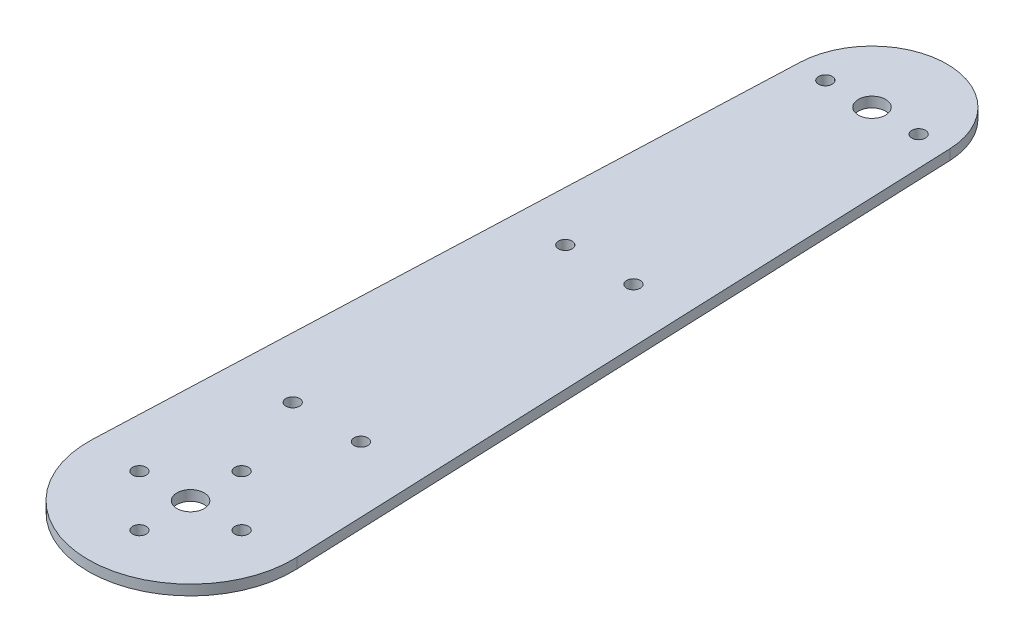
ISO-10303-21;
HEADER;
FILE_DESCRIPTION(('STEP AP214'),'2;1');
FILE_NAME('part.step','',(''),(''),'','','');
FILE_SCHEMA(('AUTOMOTIVE_DESIGN { 1 0 10303 214 1 1 1 1 }'));
ENDSEC;
DATA;
#1=APPLICATION_CONTEXT('core data for automotive mechanical design processes');
#2=APPLICATION_PROTOCOL_DEFINITION('international standard','automotive_design',2000,#1);
#3=PRODUCT_CONTEXT('',#1,'mechanical');
#4=PRODUCT('Part','Part','',(#3));
#5=PRODUCT_RELATED_PRODUCT_CATEGORY('part','',(#4));
#6=PRODUCT_DEFINITION_FORMATION('','',#4);
#7=PRODUCT_DEFINITION_CONTEXT('part definition',#1,'design');
#8=PRODUCT_DEFINITION('design','',#6,#7);
#9=PRODUCT_DEFINITION_SHAPE('','',#8);
#10=(LENGTH_UNIT() NAMED_UNIT(*) SI_UNIT(.MILLI.,.METRE.));
#11=(NAMED_UNIT(*) PLANE_ANGLE_UNIT() SI_UNIT($,.RADIAN.));
#12=(NAMED_UNIT(*) SI_UNIT($,.STERADIAN.) SOLID_ANGLE_UNIT());
#13=UNCERTAINTY_MEASURE_WITH_UNIT(LENGTH_MEASURE(1.E-05),#10,'distance_accuracy_value','');
#14=(GEOMETRIC_REPRESENTATION_CONTEXT(3) GLOBAL_UNCERTAINTY_ASSIGNED_CONTEXT((#13)) GLOBAL_UNIT_ASSIGNED_CONTEXT((#10,
#11,#12)) REPRESENTATION_CONTEXT('',''));
#15=CARTESIAN_POINT('',(0.,0.,0.));
#16=DIRECTION('',(0.,0.,1.));
#17=DIRECTION('',(1.,0.,0.));
#18=AXIS2_PLACEMENT_3D('',#15,#16,#17);
#19=CARTESIAN_POINT('',(0.,-3.,-200.));
#20=DIRECTION('',(0.,1.,0.));
#21=DIRECTION('',(0.,0.,1.));
#22=AXIS2_PLACEMENT_3D('',#19,#20,#21);
#23=CYLINDRICAL_SURFACE('',#22,22.);
#24=CARTESIAN_POINT('',(0.,0.,-200.));
#25=DIRECTION('',(0.,1.,0.));
#26=DIRECTION('',(0.,0.,1.));
#27=AXIS2_PLACEMENT_3D('',#24,#25,#26);
#28=CIRCLE('',#27,22.);
#29=CARTESIAN_POINT('',(21.9823929543624,0.,-200.88));
#30=VERTEX_POINT('',#29);
#31=CARTESIAN_POINT('',(-21.9823929543624,0.,-200.88));
#32=VERTEX_POINT('',#31);
#33=EDGE_CURVE('E102',#30,#32,#28,.T.);
#34=ORIENTED_EDGE('',*,*,#33,.F.);
#35=DIRECTION('',(0.,1.,0.));
#36=VECTOR('',#35,1.);
#37=CARTESIAN_POINT('',(21.9823929543624,-3.,-200.88));
#38=LINE('',#37,#36);
#39=CARTESIAN_POINT('',(21.9823929543624,-3.,-200.88));
#40=VERTEX_POINT('',#39);
#41=EDGE_CURVE('E11',#40,#30,#38,.T.);
#42=ORIENTED_EDGE('',*,*,#41,.F.);
#43=CARTESIAN_POINT('',(0.,-3.,-200.));
#44=DIRECTION('',(0.,1.,0.));
#45=DIRECTION('',(0.,0.,1.));
#46=AXIS2_PLACEMENT_3D('',#43,#44,#45);
#47=CIRCLE('',#46,22.);
#48=CARTESIAN_POINT('',(-21.9823929543624,-3.,-200.88));
#49=VERTEX_POINT('',#48);
#50=EDGE_CURVE('E95',#40,#49,#47,.T.);
#51=ORIENTED_EDGE('',*,*,#50,.T.);
#52=DIRECTION('',(0.,1.,0.));
#53=VECTOR('',#52,1.);
#54=CARTESIAN_POINT('',(-21.9823929543624,-3.,-200.88));
#55=LINE('',#54,#53);
#56=EDGE_CURVE('E40',#49,#32,#55,.T.);
#57=ORIENTED_EDGE('',*,*,#56,.T.);
#58=EDGE_LOOP('',(#34,#42,#51,#57));
#59=FACE_BOUND('',#58,.T.);
#60=ADVANCED_FACE('F37',(#59),#23,.T.);
#61=CARTESIAN_POINT('',(21.9823929543624,-3.,-200.88));
#62=DIRECTION('',(0.999199679743744,0.,-0.04));
#63=DIRECTION('',(-0.04,0.,-0.999199679743744));
#64=AXIS2_PLACEMENT_3D('',#61,#62,#63);
#65=PLANE('',#64);
#66=DIRECTION('',(-0.04,0.,-0.999199679743744));
#67=VECTOR('',#66,1.);
#68=CARTESIAN_POINT('',(21.9823929543624,0.,-200.88));
#69=LINE('',#68,#67);
#70=CARTESIAN_POINT('',(29.9759903923123,0.,-1.2));
#71=VERTEX_POINT('',#70);
#72=EDGE_CURVE('E97',#71,#30,#69,.T.);
#73=ORIENTED_EDGE('',*,*,#72,.F.);
#74=DIRECTION('',(0.,1.,0.));
#75=VECTOR('',#74,1.);
#76=CARTESIAN_POINT('',(29.9759903923123,-3.,-1.2));
#77=LINE('',#76,#75);
#78=CARTESIAN_POINT('',(29.9759903923123,-3.,-1.2));
#79=VERTEX_POINT('',#78);
#80=EDGE_CURVE('E46',#79,#71,#77,.T.);
#81=ORIENTED_EDGE('',*,*,#80,.F.);
#82=DIRECTION('',(-0.04,0.,-0.999199679743744));
#83=VECTOR('',#82,1.);
#84=CARTESIAN_POINT('',(21.9823929543624,-3.,-200.88));
#85=LINE('',#84,#83);
#86=EDGE_CURVE('E92',#79,#40,#85,.T.);
#87=ORIENTED_EDGE('',*,*,#86,.T.);
#88=ORIENTED_EDGE('',*,*,#41,.T.);
#89=EDGE_LOOP('',(#73,#81,#87,#88));
#90=FACE_BOUND('',#89,.T.);
#91=ADVANCED_FACE('F113',(#90),#65,.T.);
#92=CARTESIAN_POINT('',(0.,-3.,0.));
#93=DIRECTION('',(0.,1.,0.));
#94=DIRECTION('',(0.,0.,1.));
#95=AXIS2_PLACEMENT_3D('',#92,#93,#94);
#96=CYLINDRICAL_SURFACE('',#95,30.);
#97=CARTESIAN_POINT('',(0.,0.,0.));
#98=DIRECTION('',(0.,1.,0.));
#99=DIRECTION('',(0.,0.,1.));
#100=AXIS2_PLACEMENT_3D('',#97,#98,#99);
#101=CIRCLE('',#100,30.);
#102=CARTESIAN_POINT('',(-29.9759903923123,0.,-1.20000000000001));
#103=VERTEX_POINT('',#102);
#104=EDGE_CURVE('E87',#103,#71,#101,.T.);
#105=ORIENTED_EDGE('',*,*,#104,.F.);
#106=DIRECTION('',(0.,1.,0.));
#107=VECTOR('',#106,1.);
#108=CARTESIAN_POINT('',(-29.9759903923123,-3.,-1.20000000000001));
#109=LINE('',#108,#107);
#110=CARTESIAN_POINT('',(-29.9759903923123,-3.,-1.20000000000001));
#111=VERTEX_POINT('',#110);
#112=EDGE_CURVE('E82',#111,#103,#109,.T.);
#113=ORIENTED_EDGE('',*,*,#112,.F.);
#114=CARTESIAN_POINT('',(0.,-3.,0.));
#115=DIRECTION('',(0.,1.,0.));
#116=DIRECTION('',(0.,0.,1.));
#117=AXIS2_PLACEMENT_3D('',#114,#115,#116);
#118=CIRCLE('',#117,30.);
#119=EDGE_CURVE('E85',#111,#79,#118,.T.);
#120=ORIENTED_EDGE('',*,*,#119,.T.);
#121=ORIENTED_EDGE('',*,*,#80,.T.);
#122=EDGE_LOOP('',(#105,#113,#120,#121));
#123=FACE_BOUND('',#122,.T.);
#124=ADVANCED_FACE('F84',(#123),#96,.T.);
#125=CARTESIAN_POINT('',(-21.9823929543624,-3.,-200.88));
#126=DIRECTION('',(-0.999199679743744,0.,-0.04));
#127=DIRECTION('',(-0.04,0.,0.999199679743744));
#128=AXIS2_PLACEMENT_3D('',#125,#126,#127);
#129=PLANE('',#128);
#130=DIRECTION('',(-0.04,0.,0.999199679743744));
#131=VECTOR('',#130,1.);
#132=CARTESIAN_POINT('',(-21.9823929543624,0.,-200.88));
#133=LINE('',#132,#131);
#134=EDGE_CURVE('E105',#32,#103,#133,.T.);
#135=ORIENTED_EDGE('',*,*,#134,.F.);
#136=ORIENTED_EDGE('',*,*,#56,.F.);
#137=DIRECTION('',(-0.04,0.,0.999199679743744));
#138=VECTOR('',#137,1.);
#139=CARTESIAN_POINT('',(-21.9823929543624,-3.,-200.88));
#140=LINE('',#139,#138);
#141=EDGE_CURVE('E91',#49,#111,#140,.T.);
#142=ORIENTED_EDGE('',*,*,#141,.T.);
#143=ORIENTED_EDGE('',*,*,#112,.T.);
#144=EDGE_LOOP('',(#135,#136,#142,#143));
#145=FACE_BOUND('',#144,.T.);
#146=ADVANCED_FACE('F94',(#145),#129,.T.);
#147=CARTESIAN_POINT('',(0.,-3.,-200.));
#148=DIRECTION('',(0.,1.,0.));
#149=DIRECTION('',(0.,0.,1.));
#150=AXIS2_PLACEMENT_3D('',#147,#148,#149);
#151=PLANE('',#150);
#152=CARTESIAN_POINT('',(13.6930321584146,-3.,-200.));
#153=DIRECTION('',(0.,1.,0.));
#154=DIRECTION('',(0.,0.,-1.));
#155=AXIS2_PLACEMENT_3D('',#152,#153,#154);
#156=CIRCLE('',#155,2.);
#157=CARTESIAN_POINT('',(13.6930321584146,-3.,-202.));
#158=VERTEX_POINT('',#157);
#159=EDGE_CURVE('E186',#158,#158,#156,.T.);
#160=ORIENTED_EDGE('',*,*,#159,.T.);
#161=EDGE_LOOP('',(#160));
#162=FACE_BOUND('',#161,.T.);
#163=CARTESIAN_POINT('',(-13.6930321584146,-3.,-200.));
#164=DIRECTION('',(0.,1.,0.));
#165=DIRECTION('',(0.,0.,1.));
#166=AXIS2_PLACEMENT_3D('',#163,#164,#165);
#167=CIRCLE('',#166,2.);
#168=CARTESIAN_POINT('',(-13.6930321584146,-3.,-198.));
#169=VERTEX_POINT('',#168);
#170=EDGE_CURVE('E194',#169,#169,#167,.T.);
#171=ORIENTED_EDGE('',*,*,#170,.T.);
#172=EDGE_LOOP('',(#171));
#173=FACE_BOUND('',#172,.T.);
#174=CARTESIAN_POINT('',(-15.,-3.,-1.57116660247941E-13));
#175=DIRECTION('',(0.,1.,0.));
#176=DIRECTION('',(0.,0.,1.));
#177=AXIS2_PLACEMENT_3D('',#174,#175,#176);
#178=CIRCLE('',#177,2.);
#179=CARTESIAN_POINT('',(-15.,-3.,1.99999999999984));
#180=VERTEX_POINT('',#179);
#181=EDGE_CURVE('E200',#180,#180,#178,.T.);
#182=ORIENTED_EDGE('',*,*,#181,.T.);
#183=EDGE_LOOP('',(#182));
#184=FACE_BOUND('',#183,.T.);
#185=CARTESIAN_POINT('',(-1.04744440165294E-13,-3.,15.));
#186=DIRECTION('',(0.,1.,0.));
#187=DIRECTION('',(0.,0.,1.));
#188=AXIS2_PLACEMENT_3D('',#185,#186,#187);
#189=CIRCLE('',#188,2.);
#190=CARTESIAN_POINT('',(-1.04744440165294E-13,-3.,17.));
#191=VERTEX_POINT('',#190);
#192=EDGE_CURVE('E206',#191,#191,#189,.T.);
#193=ORIENTED_EDGE('',*,*,#192,.T.);
#194=EDGE_LOOP('',(#193));
#195=FACE_BOUND('',#194,.T.);
#196=CARTESIAN_POINT('',(15.,-3.,0.));
#197=DIRECTION('',(0.,1.,0.));
#198=DIRECTION('',(0.,0.,1.));
#199=AXIS2_PLACEMENT_3D('',#196,#197,#198);
#200=CIRCLE('',#199,2.);
#201=CARTESIAN_POINT('',(15.,-3.,2.00000000000005));
#202=VERTEX_POINT('',#201);
#203=EDGE_CURVE('E212',#202,#202,#200,.T.);
#204=ORIENTED_EDGE('',*,*,#203,.T.);
#205=EDGE_LOOP('',(#204));
#206=FACE_BOUND('',#205,.T.);
#207=CARTESIAN_POINT('',(0.,-3.,-15.));
#208=DIRECTION('',(0.,1.,0.));
#209=DIRECTION('',(0.,0.,1.));
#210=AXIS2_PLACEMENT_3D('',#207,#208,#209);
#211=CIRCLE('',#210,2.);
#212=CARTESIAN_POINT('',(0.,-3.,-13.));
#213=VERTEX_POINT('',#212);
#214=EDGE_CURVE('E218',#213,#213,#211,.T.);
#215=ORIENTED_EDGE('',*,*,#214,.T.);
#216=EDGE_LOOP('',(#215));
#217=FACE_BOUND('',#216,.T.);
#218=CARTESIAN_POINT('',(-10.,-3.,-40.));
#219=DIRECTION('',(0.,1.,0.));
#220=DIRECTION('',(0.,0.,1.));
#221=AXIS2_PLACEMENT_3D('',#218,#219,#220);
#222=CIRCLE('',#221,2.);
#223=CARTESIAN_POINT('',(-10.,-3.,-38.));
#224=VERTEX_POINT('',#223);
#225=EDGE_CURVE('E224',#224,#224,#222,.T.);
#226=ORIENTED_EDGE('',*,*,#225,.T.);
#227=EDGE_LOOP('',(#226));
#228=FACE_BOUND('',#227,.T.);
#229=CARTESIAN_POINT('',(10.,-3.,-40.));
#230=DIRECTION('',(0.,1.,0.));
#231=DIRECTION('',(0.,0.,1.));
#232=AXIS2_PLACEMENT_3D('',#229,#230,#231);
#233=CIRCLE('',#232,2.);
#234=CARTESIAN_POINT('',(10.,-3.,-38.));
#235=VERTEX_POINT('',#234);
#236=EDGE_CURVE('E230',#235,#235,#233,.T.);
#237=ORIENTED_EDGE('',*,*,#236,.T.);
#238=EDGE_LOOP('',(#237));
#239=FACE_BOUND('',#238,.T.);
#240=CARTESIAN_POINT('',(-10.,-3.,-120.));
#241=DIRECTION('',(0.,1.,0.));
#242=DIRECTION('',(0.,0.,1.));
#243=AXIS2_PLACEMENT_3D('',#240,#241,#242);
#244=CIRCLE('',#243,2.);
#245=CARTESIAN_POINT('',(-10.,-3.,-118.));
#246=VERTEX_POINT('',#245);
#247=EDGE_CURVE('E236',#246,#246,#244,.T.);
#248=ORIENTED_EDGE('',*,*,#247,.T.);
#249=EDGE_LOOP('',(#248));
#250=FACE_BOUND('',#249,.T.);
#251=CARTESIAN_POINT('',(10.,-3.,-120.));
#252=DIRECTION('',(0.,1.,0.));
#253=DIRECTION('',(0.,0.,1.));
#254=AXIS2_PLACEMENT_3D('',#251,#252,#253);
#255=CIRCLE('',#254,2.);
#256=CARTESIAN_POINT('',(10.,-3.,-118.));
#257=VERTEX_POINT('',#256);
#258=EDGE_CURVE('E242',#257,#257,#255,.T.);
#259=ORIENTED_EDGE('',*,*,#258,.T.);
#260=EDGE_LOOP('',(#259));
#261=FACE_BOUND('',#260,.T.);
#262=CARTESIAN_POINT('',(0.,-3.,-200.));
#263=DIRECTION('',(0.,1.,0.));
#264=DIRECTION('',(0.,0.,1.));
#265=AXIS2_PLACEMENT_3D('',#262,#263,#264);
#266=CIRCLE('',#265,4.);
#267=CARTESIAN_POINT('',(0.,-3.,-196.));
#268=VERTEX_POINT('',#267);
#269=EDGE_CURVE('E248',#268,#268,#266,.T.);
#270=ORIENTED_EDGE('',*,*,#269,.T.);
#271=EDGE_LOOP('',(#270));
#272=FACE_BOUND('',#271,.T.);
#273=CARTESIAN_POINT('',(0.,-3.,0.));
#274=DIRECTION('',(0.,1.,0.));
#275=DIRECTION('',(0.,0.,1.));
#276=AXIS2_PLACEMENT_3D('',#273,#274,#275);
#277=CIRCLE('',#276,4.);
#278=CARTESIAN_POINT('',(0.,-3.,4.));
#279=VERTEX_POINT('',#278);
#280=EDGE_CURVE('E106',#279,#279,#277,.T.);
#281=ORIENTED_EDGE('',*,*,#280,.T.);
#282=EDGE_LOOP('',(#281));
#283=FACE_BOUND('',#282,.T.);
#284=ORIENTED_EDGE('',*,*,#50,.F.);
#285=ORIENTED_EDGE('',*,*,#86,.F.);
#286=ORIENTED_EDGE('',*,*,#119,.F.);
#287=ORIENTED_EDGE('',*,*,#141,.F.);
#288=EDGE_LOOP('',(#284,#285,#286,#287));
#289=FACE_BOUND('',#288,.T.);
#290=ADVANCED_FACE('F90',(#162,#173,#184,#195,#206,#217,#228,#239,#250,#261,#272,#283,#289),
#151,.F.);
#291=CARTESIAN_POINT('',(0.,0.,-200.));
#292=DIRECTION('',(0.,1.,0.));
#293=DIRECTION('',(0.,0.,1.));
#294=AXIS2_PLACEMENT_3D('',#291,#292,#293);
#295=PLANE('',#294);
#296=CARTESIAN_POINT('',(13.6930321584146,0.,-200.));
#297=DIRECTION('',(0.,1.,0.));
#298=DIRECTION('',(0.,0.,-1.));
#299=AXIS2_PLACEMENT_3D('',#296,#297,#298);
#300=CIRCLE('',#299,2.);
#301=CARTESIAN_POINT('',(13.6930321584146,0.,-202.));
#302=VERTEX_POINT('',#301);
#303=EDGE_CURVE('E189',#302,#302,#300,.T.);
#304=ORIENTED_EDGE('',*,*,#303,.F.);
#305=EDGE_LOOP('',(#304));
#306=FACE_BOUND('',#305,.T.);
#307=CARTESIAN_POINT('',(-13.6930321584146,0.,-200.));
#308=DIRECTION('',(0.,1.,0.));
#309=DIRECTION('',(0.,0.,1.));
#310=AXIS2_PLACEMENT_3D('',#307,#308,#309);
#311=CIRCLE('',#310,2.);
#312=CARTESIAN_POINT('',(-13.6930321584146,0.,-198.));
#313=VERTEX_POINT('',#312);
#314=EDGE_CURVE('E191',#313,#313,#311,.T.);
#315=ORIENTED_EDGE('',*,*,#314,.F.);
#316=EDGE_LOOP('',(#315));
#317=FACE_BOUND('',#316,.T.);
#318=CARTESIAN_POINT('',(-15.,0.,-1.57116660247941E-13));
#319=DIRECTION('',(0.,1.,0.));
#320=DIRECTION('',(0.,0.,1.));
#321=AXIS2_PLACEMENT_3D('',#318,#319,#320);
#322=CIRCLE('',#321,2.);
#323=CARTESIAN_POINT('',(-15.,0.,1.99999999999984));
#324=VERTEX_POINT('',#323);
#325=EDGE_CURVE('E197',#324,#324,#322,.T.);
#326=ORIENTED_EDGE('',*,*,#325,.F.);
#327=EDGE_LOOP('',(#326));
#328=FACE_BOUND('',#327,.T.);
#329=CARTESIAN_POINT('',(-1.04744440165294E-13,0.,15.));
#330=DIRECTION('',(0.,1.,0.));
#331=DIRECTION('',(0.,0.,1.));
#332=AXIS2_PLACEMENT_3D('',#329,#330,#331);
#333=CIRCLE('',#332,2.);
#334=CARTESIAN_POINT('',(-1.04744440165294E-13,0.,17.));
#335=VERTEX_POINT('',#334);
#336=EDGE_CURVE('E203',#335,#335,#333,.T.);
#337=ORIENTED_EDGE('',*,*,#336,.F.);
#338=EDGE_LOOP('',(#337));
#339=FACE_BOUND('',#338,.T.);
#340=CARTESIAN_POINT('',(15.,0.,0.));
#341=DIRECTION('',(0.,1.,0.));
#342=DIRECTION('',(0.,0.,1.));
#343=AXIS2_PLACEMENT_3D('',#340,#341,#342);
#344=CIRCLE('',#343,2.);
#345=CARTESIAN_POINT('',(15.,0.,2.00000000000005));
#346=VERTEX_POINT('',#345);
#347=EDGE_CURVE('E209',#346,#346,#344,.T.);
#348=ORIENTED_EDGE('',*,*,#347,.F.);
#349=EDGE_LOOP('',(#348));
#350=FACE_BOUND('',#349,.T.);
#351=CARTESIAN_POINT('',(0.,0.,-15.));
#352=DIRECTION('',(0.,1.,0.));
#353=DIRECTION('',(0.,0.,1.));
#354=AXIS2_PLACEMENT_3D('',#351,#352,#353);
#355=CIRCLE('',#354,2.);
#356=CARTESIAN_POINT('',(0.,0.,-13.));
#357=VERTEX_POINT('',#356);
#358=EDGE_CURVE('E215',#357,#357,#355,.T.);
#359=ORIENTED_EDGE('',*,*,#358,.F.);
#360=EDGE_LOOP('',(#359));
#361=FACE_BOUND('',#360,.T.);
#362=CARTESIAN_POINT('',(-10.,0.,-40.));
#363=DIRECTION('',(0.,1.,0.));
#364=DIRECTION('',(0.,0.,1.));
#365=AXIS2_PLACEMENT_3D('',#362,#363,#364);
#366=CIRCLE('',#365,2.);
#367=CARTESIAN_POINT('',(-10.,0.,-38.));
#368=VERTEX_POINT('',#367);
#369=EDGE_CURVE('E221',#368,#368,#366,.T.);
#370=ORIENTED_EDGE('',*,*,#369,.F.);
#371=EDGE_LOOP('',(#370));
#372=FACE_BOUND('',#371,.T.);
#373=CARTESIAN_POINT('',(10.,0.,-40.));
#374=DIRECTION('',(0.,1.,0.));
#375=DIRECTION('',(0.,0.,1.));
#376=AXIS2_PLACEMENT_3D('',#373,#374,#375);
#377=CIRCLE('',#376,2.);
#378=CARTESIAN_POINT('',(10.,0.,-38.));
#379=VERTEX_POINT('',#378);
#380=EDGE_CURVE('E227',#379,#379,#377,.T.);
#381=ORIENTED_EDGE('',*,*,#380,.F.);
#382=EDGE_LOOP('',(#381));
#383=FACE_BOUND('',#382,.T.);
#384=CARTESIAN_POINT('',(-10.,0.,-120.));
#385=DIRECTION('',(0.,1.,0.));
#386=DIRECTION('',(0.,0.,1.));
#387=AXIS2_PLACEMENT_3D('',#384,#385,#386);
#388=CIRCLE('',#387,2.);
#389=CARTESIAN_POINT('',(-10.,0.,-118.));
#390=VERTEX_POINT('',#389);
#391=EDGE_CURVE('E233',#390,#390,#388,.T.);
#392=ORIENTED_EDGE('',*,*,#391,.F.);
#393=EDGE_LOOP('',(#392));
#394=FACE_BOUND('',#393,.T.);
#395=CARTESIAN_POINT('',(10.,0.,-120.));
#396=DIRECTION('',(0.,1.,0.));
#397=DIRECTION('',(0.,0.,1.));
#398=AXIS2_PLACEMENT_3D('',#395,#396,#397);
#399=CIRCLE('',#398,2.);
#400=CARTESIAN_POINT('',(10.,0.,-118.));
#401=VERTEX_POINT('',#400);
#402=EDGE_CURVE('E239',#401,#401,#399,.T.);
#403=ORIENTED_EDGE('',*,*,#402,.F.);
#404=EDGE_LOOP('',(#403));
#405=FACE_BOUND('',#404,.T.);
#406=CARTESIAN_POINT('',(0.,0.,-200.));
#407=DIRECTION('',(0.,1.,0.));
#408=DIRECTION('',(0.,0.,1.));
#409=AXIS2_PLACEMENT_3D('',#406,#407,#408);
#410=CIRCLE('',#409,4.);
#411=CARTESIAN_POINT('',(0.,0.,-196.));
#412=VERTEX_POINT('',#411);
#413=EDGE_CURVE('E245',#412,#412,#410,.T.);
#414=ORIENTED_EDGE('',*,*,#413,.F.);
#415=EDGE_LOOP('',(#414));
#416=FACE_BOUND('',#415,.T.);
#417=CARTESIAN_POINT('',(0.,0.,0.));
#418=DIRECTION('',(0.,1.,0.));
#419=DIRECTION('',(0.,0.,1.));
#420=AXIS2_PLACEMENT_3D('',#417,#418,#419);
#421=CIRCLE('',#420,4.);
#422=CARTESIAN_POINT('',(0.,0.,4.));
#423=VERTEX_POINT('',#422);
#424=EDGE_CURVE('E251',#423,#423,#421,.T.);
#425=ORIENTED_EDGE('',*,*,#424,.F.);
#426=EDGE_LOOP('',(#425));
#427=FACE_BOUND('',#426,.T.);
#428=ORIENTED_EDGE('',*,*,#33,.T.);
#429=ORIENTED_EDGE('',*,*,#134,.T.);
#430=ORIENTED_EDGE('',*,*,#104,.T.);
#431=ORIENTED_EDGE('',*,*,#72,.T.);
#432=EDGE_LOOP('',(#428,#429,#430,#431));
#433=FACE_BOUND('',#432,.T.);
#434=ADVANCED_FACE('F112',(#306,#317,#328,#339,#350,#361,#372,#383,#394,#405,#416,#427,#433),
#295,.T.);
#435=CARTESIAN_POINT('',(0.,-3.,0.));
#436=DIRECTION('',(0.,1.,0.));
#437=DIRECTION('',(0.,0.,1.));
#438=AXIS2_PLACEMENT_3D('',#435,#436,#437);
#439=CYLINDRICAL_SURFACE('',#438,4.);
#440=ORIENTED_EDGE('',*,*,#280,.F.);
#441=EDGE_LOOP('',(#440));
#442=FACE_BOUND('',#441,.T.);
#443=ORIENTED_EDGE('',*,*,#424,.T.);
#444=EDGE_LOOP('',(#443));
#445=FACE_BOUND('',#444,.T.);
#446=ADVANCED_FACE('F131',(#442,#445),#439,.F.);
#447=CARTESIAN_POINT('',(0.,-3.,-200.));
#448=DIRECTION('',(0.,1.,0.));
#449=DIRECTION('',(0.,0.,1.));
#450=AXIS2_PLACEMENT_3D('',#447,#448,#449);
#451=CYLINDRICAL_SURFACE('',#450,4.);
#452=ORIENTED_EDGE('',*,*,#269,.F.);
#453=EDGE_LOOP('',(#452));
#454=FACE_BOUND('',#453,.T.);
#455=ORIENTED_EDGE('',*,*,#413,.T.);
#456=EDGE_LOOP('',(#455));
#457=FACE_BOUND('',#456,.T.);
#458=ADVANCED_FACE('F138',(#454,#457),#451,.F.);
#459=CARTESIAN_POINT('',(10.,-3.,-120.));
#460=DIRECTION('',(0.,1.,0.));
#461=DIRECTION('',(0.,0.,1.));
#462=AXIS2_PLACEMENT_3D('',#459,#460,#461);
#463=CYLINDRICAL_SURFACE('',#462,2.);
#464=ORIENTED_EDGE('',*,*,#258,.F.);
#465=EDGE_LOOP('',(#464));
#466=FACE_BOUND('',#465,.T.);
#467=ORIENTED_EDGE('',*,*,#402,.T.);
#468=EDGE_LOOP('',(#467));
#469=FACE_BOUND('',#468,.T.);
#470=ADVANCED_FACE('F142',(#466,#469),#463,.F.);
#471=CARTESIAN_POINT('',(-10.,-3.,-120.));
#472=DIRECTION('',(0.,1.,0.));
#473=DIRECTION('',(0.,0.,1.));
#474=AXIS2_PLACEMENT_3D('',#471,#472,#473);
#475=CYLINDRICAL_SURFACE('',#474,2.);
#476=ORIENTED_EDGE('',*,*,#247,.F.);
#477=EDGE_LOOP('',(#476));
#478=FACE_BOUND('',#477,.T.);
#479=ORIENTED_EDGE('',*,*,#391,.T.);
#480=EDGE_LOOP('',(#479));
#481=FACE_BOUND('',#480,.T.);
#482=ADVANCED_FACE('F146',(#478,#481),#475,.F.);
#483=CARTESIAN_POINT('',(10.,-3.,-40.));
#484=DIRECTION('',(0.,1.,0.));
#485=DIRECTION('',(0.,0.,1.));
#486=AXIS2_PLACEMENT_3D('',#483,#484,#485);
#487=CYLINDRICAL_SURFACE('',#486,2.);
#488=ORIENTED_EDGE('',*,*,#236,.F.);
#489=EDGE_LOOP('',(#488));
#490=FACE_BOUND('',#489,.T.);
#491=ORIENTED_EDGE('',*,*,#380,.T.);
#492=EDGE_LOOP('',(#491));
#493=FACE_BOUND('',#492,.T.);
#494=ADVANCED_FACE('F150',(#490,#493),#487,.F.);
#495=CARTESIAN_POINT('',(-10.,-3.,-40.));
#496=DIRECTION('',(0.,1.,0.));
#497=DIRECTION('',(0.,0.,1.));
#498=AXIS2_PLACEMENT_3D('',#495,#496,#497);
#499=CYLINDRICAL_SURFACE('',#498,2.);
#500=ORIENTED_EDGE('',*,*,#225,.F.);
#501=EDGE_LOOP('',(#500));
#502=FACE_BOUND('',#501,.T.);
#503=ORIENTED_EDGE('',*,*,#369,.T.);
#504=EDGE_LOOP('',(#503));
#505=FACE_BOUND('',#504,.T.);
#506=ADVANCED_FACE('F154',(#502,#505),#499,.F.);
#507=CARTESIAN_POINT('',(0.,-3.,-15.));
#508=DIRECTION('',(0.,1.,0.));
#509=DIRECTION('',(0.,0.,1.));
#510=AXIS2_PLACEMENT_3D('',#507,#508,#509);
#511=CYLINDRICAL_SURFACE('',#510,2.);
#512=ORIENTED_EDGE('',*,*,#214,.F.);
#513=EDGE_LOOP('',(#512));
#514=FACE_BOUND('',#513,.T.);
#515=ORIENTED_EDGE('',*,*,#358,.T.);
#516=EDGE_LOOP('',(#515));
#517=FACE_BOUND('',#516,.T.);
#518=ADVANCED_FACE('F158',(#514,#517),#511,.F.);
#519=CARTESIAN_POINT('',(15.,-3.,0.));
#520=DIRECTION('',(0.,1.,0.));
#521=DIRECTION('',(0.,0.,1.));
#522=AXIS2_PLACEMENT_3D('',#519,#520,#521);
#523=CYLINDRICAL_SURFACE('',#522,2.);
#524=ORIENTED_EDGE('',*,*,#203,.F.);
#525=EDGE_LOOP('',(#524));
#526=FACE_BOUND('',#525,.T.);
#527=ORIENTED_EDGE('',*,*,#347,.T.);
#528=EDGE_LOOP('',(#527));
#529=FACE_BOUND('',#528,.T.);
#530=ADVANCED_FACE('F162',(#526,#529),#523,.F.);
#531=CARTESIAN_POINT('',(-1.04744440165294E-13,-3.,15.));
#532=DIRECTION('',(0.,1.,0.));
#533=DIRECTION('',(0.,0.,1.));
#534=AXIS2_PLACEMENT_3D('',#531,#532,#533);
#535=CYLINDRICAL_SURFACE('',#534,2.);
#536=ORIENTED_EDGE('',*,*,#192,.F.);
#537=EDGE_LOOP('',(#536));
#538=FACE_BOUND('',#537,.T.);
#539=ORIENTED_EDGE('',*,*,#336,.T.);
#540=EDGE_LOOP('',(#539));
#541=FACE_BOUND('',#540,.T.);
#542=ADVANCED_FACE('F166',(#538,#541),#535,.F.);
#543=CARTESIAN_POINT('',(-15.,-3.,-1.57116660247941E-13));
#544=DIRECTION('',(0.,1.,0.));
#545=DIRECTION('',(0.,0.,1.));
#546=AXIS2_PLACEMENT_3D('',#543,#544,#545);
#547=CYLINDRICAL_SURFACE('',#546,2.);
#548=ORIENTED_EDGE('',*,*,#181,.F.);
#549=EDGE_LOOP('',(#548));
#550=FACE_BOUND('',#549,.T.);
#551=ORIENTED_EDGE('',*,*,#325,.T.);
#552=EDGE_LOOP('',(#551));
#553=FACE_BOUND('',#552,.T.);
#554=ADVANCED_FACE('F170',(#550,#553),#547,.F.);
#555=CARTESIAN_POINT('',(-13.6930321584146,-3.,-200.));
#556=DIRECTION('',(0.,1.,0.));
#557=DIRECTION('',(0.,0.,1.));
#558=AXIS2_PLACEMENT_3D('',#555,#556,#557);
#559=CYLINDRICAL_SURFACE('',#558,2.);
#560=ORIENTED_EDGE('',*,*,#170,.F.);
#561=EDGE_LOOP('',(#560));
#562=FACE_BOUND('',#561,.T.);
#563=ORIENTED_EDGE('',*,*,#314,.T.);
#564=EDGE_LOOP('',(#563));
#565=FACE_BOUND('',#564,.T.);
#566=ADVANCED_FACE('F174',(#562,#565),#559,.F.);
#567=CARTESIAN_POINT('',(13.6930321584146,-3.,-200.));
#568=DIRECTION('',(0.,1.,0.));
#569=DIRECTION('',(0.,0.,1.));
#570=AXIS2_PLACEMENT_3D('',#567,#568,#569);
#571=CYLINDRICAL_SURFACE('',#570,2.);
#572=ORIENTED_EDGE('',*,*,#159,.F.);
#573=EDGE_LOOP('',(#572));
#574=FACE_BOUND('',#573,.T.);
#575=ORIENTED_EDGE('',*,*,#303,.T.);
#576=EDGE_LOOP('',(#575));
#577=FACE_BOUND('',#576,.T.);
#578=ADVANCED_FACE('F178',(#574,#577),#571,.F.);
#579=CLOSED_SHELL('',(#60,#91,#124,#146,#290,#434,#446,#458,#470,#482,#494,#506,#518,#530,#542,
#554,#566,#578));
#580=MANIFOLD_SOLID_BREP('B2',#579);
#581=ADVANCED_BREP_SHAPE_REPRESENTATION('',(#18,#580),#14);
#582=SHAPE_DEFINITION_REPRESENTATION(#9,#581);
ENDSEC;
END-ISO-10303-21;
